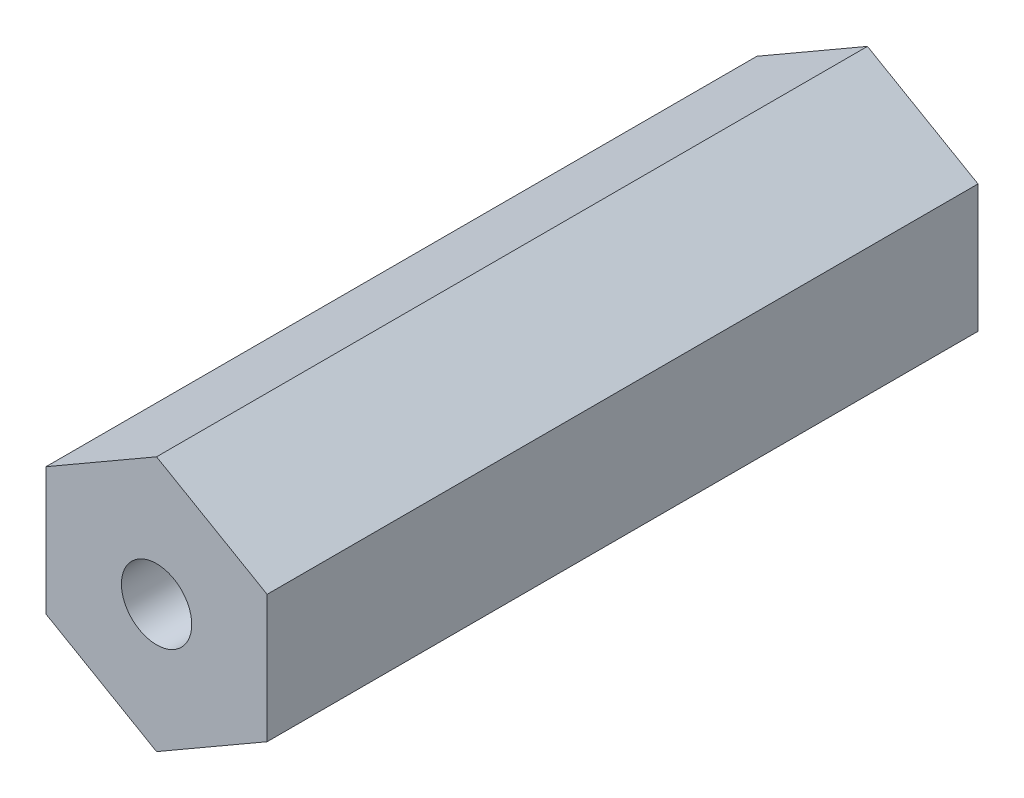
ISO-10303-21;
HEADER;
FILE_DESCRIPTION(('STEP AP214'),'2;1');
FILE_NAME('part.step','',(''),(''),'','','');
FILE_SCHEMA(('AUTOMOTIVE_DESIGN { 1 0 10303 214 1 1 1 1 }'));
ENDSEC;
DATA;
#1=APPLICATION_CONTEXT('core data for automotive mechanical design processes');
#2=APPLICATION_PROTOCOL_DEFINITION('international standard','automotive_design',2000,#1);
#3=PRODUCT_CONTEXT('',#1,'mechanical');
#4=PRODUCT('Part','Part','',(#3));
#5=PRODUCT_RELATED_PRODUCT_CATEGORY('part','',(#4));
#6=PRODUCT_DEFINITION_FORMATION('','',#4);
#7=PRODUCT_DEFINITION_CONTEXT('part definition',#1,'design');
#8=PRODUCT_DEFINITION('design','',#6,#7);
#9=PRODUCT_DEFINITION_SHAPE('','',#8);
#10=(LENGTH_UNIT() NAMED_UNIT(*) SI_UNIT(.MILLI.,.METRE.));
#11=(NAMED_UNIT(*) PLANE_ANGLE_UNIT() SI_UNIT($,.RADIAN.));
#12=(NAMED_UNIT(*) SI_UNIT($,.STERADIAN.) SOLID_ANGLE_UNIT());
#13=UNCERTAINTY_MEASURE_WITH_UNIT(LENGTH_MEASURE(1.E-05),#10,'distance_accuracy_value','');
#14=(GEOMETRIC_REPRESENTATION_CONTEXT(3) GLOBAL_UNCERTAINTY_ASSIGNED_CONTEXT((#13)) GLOBAL_UNIT_ASSIGNED_CONTEXT((#10,
#11,#12)) REPRESENTATION_CONTEXT('',''));
#15=CARTESIAN_POINT('',(0.,0.,0.));
#16=DIRECTION('',(0.,0.,1.));
#17=DIRECTION('',(1.,0.,0.));
#18=AXIS2_PLACEMENT_3D('',#15,#16,#17);
#19=CARTESIAN_POINT('',(0.,0.,40.8305));
#20=DIRECTION('',(0.,0.,1.));
#21=DIRECTION('',(1.,0.,0.));
#22=AXIS2_PLACEMENT_3D('',#19,#20,#21);
#23=PLANE('',#22);
#24=DIRECTION('',(-0.866025403784441,0.499999999999995,0.));
#25=VECTOR('',#24,1.);
#26=CARTESIAN_POINT('',(6.34999999999995,3.66617420935419,40.8305));
#27=LINE('',#26,#25);
#28=CARTESIAN_POINT('',(6.34999999999995,3.66617420935419,40.8305));
#29=VERTEX_POINT('',#28);
#30=CARTESIAN_POINT('',(0.,7.33234841870824,40.8305));
#31=VERTEX_POINT('',#30);
#32=EDGE_CURVE('E129',#29,#31,#27,.T.);
#33=ORIENTED_EDGE('',*,*,#32,.T.);
#34=DIRECTION('',(-0.866025403784438,-0.500000000000001,0.));
#35=VECTOR('',#34,1.);
#36=CARTESIAN_POINT('',(0.,7.33234841870824,40.8305));
#37=LINE('',#36,#35);
#38=CARTESIAN_POINT('',(-6.35,3.6661742093541,40.8305));
#39=VERTEX_POINT('',#38);
#40=EDGE_CURVE('E87',#31,#39,#37,.T.);
#41=ORIENTED_EDGE('',*,*,#40,.T.);
#42=DIRECTION('',(0.,-1.,0.));
#43=VECTOR('',#42,1.);
#44=CARTESIAN_POINT('',(-6.35,3.6661742093541,40.8305));
#45=LINE('',#44,#43);
#46=CARTESIAN_POINT('',(-6.34999999999997,-3.66617420935415,40.8305));
#47=VERTEX_POINT('',#46);
#48=EDGE_CURVE('E100',#39,#47,#45,.T.);
#49=ORIENTED_EDGE('',*,*,#48,.T.);
#50=DIRECTION('',(0.866025403784442,-0.499999999999995,0.));
#51=VECTOR('',#50,1.);
#52=CARTESIAN_POINT('',(-6.34999999999997,-3.66617420935415,40.8305));
#53=LINE('',#52,#51);
#54=CARTESIAN_POINT('',(0.,-7.33234841870824,40.8305));
#55=VERTEX_POINT('',#54);
#56=EDGE_CURVE('E94',#47,#55,#53,.T.);
#57=ORIENTED_EDGE('',*,*,#56,.T.);
#58=DIRECTION('',(0.866025403784435,0.500000000000007,0.));
#59=VECTOR('',#58,1.);
#60=CARTESIAN_POINT('',(0.,-7.33234841870824,40.8305));
#61=LINE('',#60,#59);
#62=CARTESIAN_POINT('',(6.35000000000002,-3.66617420935406,40.8305));
#63=VERTEX_POINT('',#62);
#64=EDGE_CURVE('E98',#55,#63,#61,.T.);
#65=ORIENTED_EDGE('',*,*,#64,.T.);
#66=DIRECTION('',(0.,1.,0.));
#67=VECTOR('',#66,1.);
#68=CARTESIAN_POINT('',(6.35000000000002,-3.66617420935406,40.8305));
#69=LINE('',#68,#67);
#70=EDGE_CURVE('E50',#63,#29,#69,.T.);
#71=ORIENTED_EDGE('',*,*,#70,.T.);
#72=EDGE_LOOP('',(#33,#41,#49,#57,#65,#71));
#73=FACE_BOUND('',#72,.T.);
#74=CARTESIAN_POINT('',(0.,0.,40.8305));
#75=DIRECTION('',(0.,0.,1.));
#76=DIRECTION('',(1.,0.,0.));
#77=AXIS2_PLACEMENT_3D('',#74,#75,#76);
#78=CIRCLE('',#77,2.0193);
#79=CARTESIAN_POINT('',(2.0193,0.,40.8305));
#80=VERTEX_POINT('',#79);
#81=EDGE_CURVE('E122',#80,#80,#78,.T.);
#82=ORIENTED_EDGE('',*,*,#81,.F.);
#83=EDGE_LOOP('',(#82));
#84=FACE_BOUND('',#83,.T.);
#85=ADVANCED_FACE('F33',(#73,#84),#23,.T.);
#86=CARTESIAN_POINT('',(0.,0.,0.));
#87=DIRECTION('',(0.,0.,1.));
#88=DIRECTION('',(1.,0.,0.));
#89=AXIS2_PLACEMENT_3D('',#86,#87,#88);
#90=PLANE('',#89);
#91=DIRECTION('',(-0.866025403784441,0.499999999999995,0.));
#92=VECTOR('',#91,1.);
#93=CARTESIAN_POINT('',(6.34999999999995,3.66617420935419,0.));
#94=LINE('',#93,#92);
#95=CARTESIAN_POINT('',(6.34999999999995,3.66617420935419,0.));
#96=VERTEX_POINT('',#95);
#97=CARTESIAN_POINT('',(0.,7.33234841870824,0.));
#98=VERTEX_POINT('',#97);
#99=EDGE_CURVE('E118',#96,#98,#94,.T.);
#100=ORIENTED_EDGE('',*,*,#99,.F.);
#101=DIRECTION('',(0.,1.,0.));
#102=VECTOR('',#101,1.);
#103=CARTESIAN_POINT('',(6.35000000000002,-3.66617420935406,0.));
#104=LINE('',#103,#102);
#105=CARTESIAN_POINT('',(6.35000000000002,-3.66617420935406,0.));
#106=VERTEX_POINT('',#105);
#107=EDGE_CURVE('E79',#106,#96,#104,.T.);
#108=ORIENTED_EDGE('',*,*,#107,.F.);
#109=DIRECTION('',(0.866025403784435,0.500000000000007,0.));
#110=VECTOR('',#109,1.);
#111=CARTESIAN_POINT('',(0.,-7.33234841870824,0.));
#112=LINE('',#111,#110);
#113=CARTESIAN_POINT('',(0.,-7.33234841870824,0.));
#114=VERTEX_POINT('',#113);
#115=EDGE_CURVE('E73',#114,#106,#112,.T.);
#116=ORIENTED_EDGE('',*,*,#115,.F.);
#117=DIRECTION('',(0.866025403784442,-0.499999999999995,0.));
#118=VECTOR('',#117,1.);
#119=CARTESIAN_POINT('',(-6.34999999999997,-3.66617420935415,0.));
#120=LINE('',#119,#118);
#121=CARTESIAN_POINT('',(-6.34999999999997,-3.66617420935415,0.));
#122=VERTEX_POINT('',#121);
#123=EDGE_CURVE('E108',#122,#114,#120,.T.);
#124=ORIENTED_EDGE('',*,*,#123,.F.);
#125=DIRECTION('',(0.,-1.,0.));
#126=VECTOR('',#125,1.);
#127=CARTESIAN_POINT('',(-6.35,3.6661742093541,0.));
#128=LINE('',#127,#126);
#129=CARTESIAN_POINT('',(-6.35,3.6661742093541,0.));
#130=VERTEX_POINT('',#129);
#131=EDGE_CURVE('E124',#130,#122,#128,.T.);
#132=ORIENTED_EDGE('',*,*,#131,.F.);
#133=DIRECTION('',(-0.866025403784438,-0.500000000000001,0.));
#134=VECTOR('',#133,1.);
#135=CARTESIAN_POINT('',(0.,7.33234841870824,0.));
#136=LINE('',#135,#134);
#137=EDGE_CURVE('E121',#98,#130,#136,.T.);
#138=ORIENTED_EDGE('',*,*,#137,.F.);
#139=EDGE_LOOP('',(#100,#108,#116,#124,#132,#138));
#140=FACE_BOUND('',#139,.T.);
#141=CARTESIAN_POINT('',(0.,0.,0.));
#142=DIRECTION('',(0.,0.,1.));
#143=DIRECTION('',(1.,0.,0.));
#144=AXIS2_PLACEMENT_3D('',#141,#142,#143);
#145=CIRCLE('',#144,2.0193);
#146=CARTESIAN_POINT('',(2.0193,0.,0.));
#147=VERTEX_POINT('',#146);
#148=EDGE_CURVE('E222',#147,#147,#145,.T.);
#149=ORIENTED_EDGE('',*,*,#148,.T.);
#150=EDGE_LOOP('',(#149));
#151=FACE_BOUND('',#150,.T.);
#152=ADVANCED_FACE('F138',(#140,#151),#90,.F.);
#153=CARTESIAN_POINT('',(6.34999999999995,3.66617420935419,40.8305));
#154=DIRECTION('',(-0.499999999999995,-0.866025403784442,0.));
#155=DIRECTION('',(0.866025403784442,-0.499999999999995,0.));
#156=AXIS2_PLACEMENT_3D('',#153,#154,#155);
#157=PLANE('',#156);
#158=ORIENTED_EDGE('',*,*,#99,.T.);
#159=DIRECTION('',(0.,0.,-1.));
#160=VECTOR('',#159,1.);
#161=CARTESIAN_POINT('',(0.,7.33234841870824,40.8305));
#162=LINE('',#161,#160);
#163=EDGE_CURVE('E11',#31,#98,#162,.T.);
#164=ORIENTED_EDGE('',*,*,#163,.F.);
#165=ORIENTED_EDGE('',*,*,#32,.F.);
#166=DIRECTION('',(0.,0.,-1.));
#167=VECTOR('',#166,1.);
#168=CARTESIAN_POINT('',(6.34999999999995,3.66617420935419,40.8305));
#169=LINE('',#168,#167);
#170=EDGE_CURVE('E114',#29,#96,#169,.T.);
#171=ORIENTED_EDGE('',*,*,#170,.T.);
#172=EDGE_LOOP('',(#158,#164,#165,#171));
#173=FACE_BOUND('',#172,.T.);
#174=ADVANCED_FACE('F35',(#173),#157,.F.);
#175=CARTESIAN_POINT('',(0.,7.33234841870824,40.8305));
#176=DIRECTION('',(0.500000000000001,-0.866025403784438,0.));
#177=DIRECTION('',(0.866025403784438,0.500000000000001,0.));
#178=AXIS2_PLACEMENT_3D('',#175,#176,#177);
#179=PLANE('',#178);
#180=ORIENTED_EDGE('',*,*,#137,.T.);
#181=DIRECTION('',(0.,0.,-1.));
#182=VECTOR('',#181,1.);
#183=CARTESIAN_POINT('',(-6.35,3.6661742093541,40.8305));
#184=LINE('',#183,#182);
#185=EDGE_CURVE('E42',#39,#130,#184,.T.);
#186=ORIENTED_EDGE('',*,*,#185,.F.);
#187=ORIENTED_EDGE('',*,*,#40,.F.);
#188=ORIENTED_EDGE('',*,*,#163,.T.);
#189=EDGE_LOOP('',(#180,#186,#187,#188));
#190=FACE_BOUND('',#189,.T.);
#191=ADVANCED_FACE('F163',(#190),#179,.F.);
#192=CARTESIAN_POINT('',(-6.35,3.6661742093541,40.8305));
#193=DIRECTION('',(1.,0.,0.));
#194=DIRECTION('',(0.,1.,0.));
#195=AXIS2_PLACEMENT_3D('',#192,#193,#194);
#196=PLANE('',#195);
#197=ORIENTED_EDGE('',*,*,#131,.T.);
#198=DIRECTION('',(0.,0.,-1.));
#199=VECTOR('',#198,1.);
#200=CARTESIAN_POINT('',(-6.34999999999997,-3.66617420935415,40.8305));
#201=LINE('',#200,#199);
#202=EDGE_CURVE('E109',#47,#122,#201,.T.);
#203=ORIENTED_EDGE('',*,*,#202,.F.);
#204=ORIENTED_EDGE('',*,*,#48,.F.);
#205=ORIENTED_EDGE('',*,*,#185,.T.);
#206=EDGE_LOOP('',(#197,#203,#204,#205));
#207=FACE_BOUND('',#206,.T.);
#208=ADVANCED_FACE('F135',(#207),#196,.F.);
#209=CARTESIAN_POINT('',(-6.34999999999997,-3.66617420935415,40.8305));
#210=DIRECTION('',(0.499999999999995,0.866025403784442,0.));
#211=DIRECTION('',(-0.866025403784442,0.499999999999995,0.));
#212=AXIS2_PLACEMENT_3D('',#209,#210,#211);
#213=PLANE('',#212);
#214=ORIENTED_EDGE('',*,*,#123,.T.);
#215=DIRECTION('',(0.,0.,-1.));
#216=VECTOR('',#215,1.);
#217=CARTESIAN_POINT('',(0.,-7.33234841870824,40.8305));
#218=LINE('',#217,#216);
#219=EDGE_CURVE('E105',#55,#114,#218,.T.);
#220=ORIENTED_EDGE('',*,*,#219,.F.);
#221=ORIENTED_EDGE('',*,*,#56,.F.);
#222=ORIENTED_EDGE('',*,*,#202,.T.);
#223=EDGE_LOOP('',(#214,#220,#221,#222));
#224=FACE_BOUND('',#223,.T.);
#225=ADVANCED_FACE('F106',(#224),#213,.F.);
#226=CARTESIAN_POINT('',(0.,-7.33234841870824,40.8305));
#227=DIRECTION('',(-0.500000000000007,0.866025403784435,0.));
#228=DIRECTION('',(-0.866025403784435,-0.500000000000007,0.));
#229=AXIS2_PLACEMENT_3D('',#226,#227,#228);
#230=PLANE('',#229);
#231=ORIENTED_EDGE('',*,*,#115,.T.);
#232=DIRECTION('',(0.,0.,-1.));
#233=VECTOR('',#232,1.);
#234=CARTESIAN_POINT('',(6.35000000000002,-3.66617420935406,40.8305));
#235=LINE('',#234,#233);
#236=EDGE_CURVE('E110',#63,#106,#235,.T.);
#237=ORIENTED_EDGE('',*,*,#236,.F.);
#238=ORIENTED_EDGE('',*,*,#64,.F.);
#239=ORIENTED_EDGE('',*,*,#219,.T.);
#240=EDGE_LOOP('',(#231,#237,#238,#239));
#241=FACE_BOUND('',#240,.T.);
#242=ADVANCED_FACE('F112',(#241),#230,.F.);
#243=CARTESIAN_POINT('',(6.35000000000002,-3.66617420935406,40.8305));
#244=DIRECTION('',(-1.,0.,0.));
#245=DIRECTION('',(0.,-1.,0.));
#246=AXIS2_PLACEMENT_3D('',#243,#244,#245);
#247=PLANE('',#246);
#248=ORIENTED_EDGE('',*,*,#107,.T.);
#249=ORIENTED_EDGE('',*,*,#170,.F.);
#250=ORIENTED_EDGE('',*,*,#70,.F.);
#251=ORIENTED_EDGE('',*,*,#236,.T.);
#252=EDGE_LOOP('',(#248,#249,#250,#251));
#253=FACE_BOUND('',#252,.T.);
#254=ADVANCED_FACE('F143',(#253),#247,.F.);
#255=CARTESIAN_POINT('',(0.,0.,40.8305));
#256=DIRECTION('',(0.,0.,-1.));
#257=DIRECTION('',(-1.,0.,0.));
#258=AXIS2_PLACEMENT_3D('',#255,#256,#257);
#259=CYLINDRICAL_SURFACE('',#258,2.0193);
#260=ORIENTED_EDGE('',*,*,#81,.T.);
#261=EDGE_LOOP('',(#260));
#262=FACE_BOUND('',#261,.T.);
#263=ORIENTED_EDGE('',*,*,#148,.F.);
#264=EDGE_LOOP('',(#263));
#265=FACE_BOUND('',#264,.T.);
#266=ADVANCED_FACE('F145',(#262,#265),#259,.F.);
#267=CLOSED_SHELL('',(#85,#152,#174,#191,#208,#225,#242,#254,#266));
#268=MANIFOLD_SOLID_BREP('B2',#267);
#269=ADVANCED_BREP_SHAPE_REPRESENTATION('',(#18,#268),#14);
#270=SHAPE_DEFINITION_REPRESENTATION(#9,#269);
ENDSEC;
END-ISO-10303-21;
